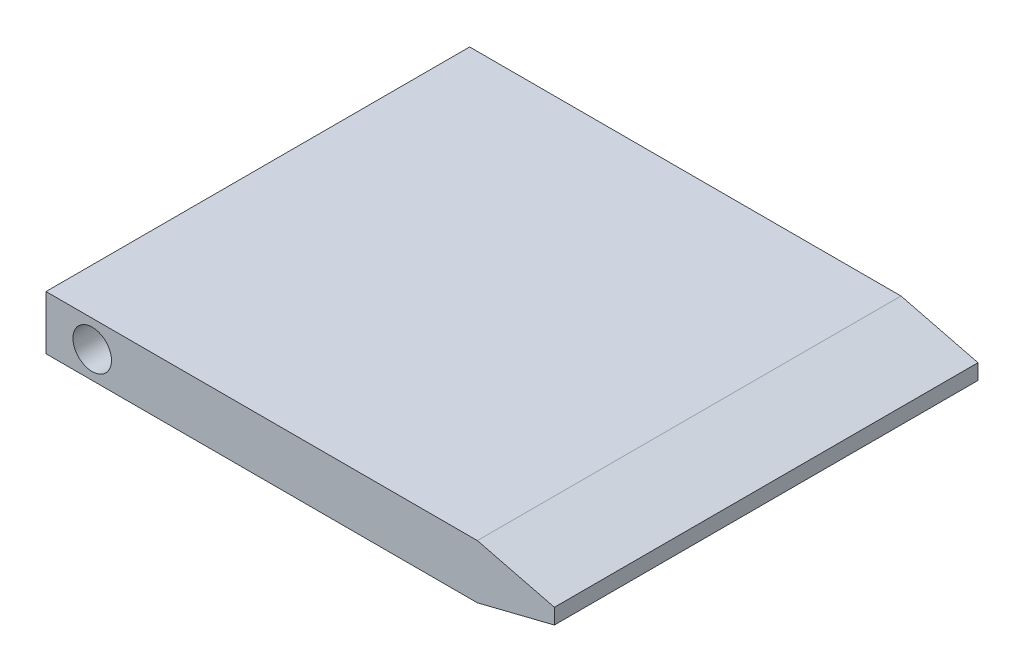
ISO-10303-21;
HEADER;
FILE_DESCRIPTION(('STEP AP214'),'2;1');
FILE_NAME('part.step','',(''),(''),'','','');
FILE_SCHEMA(('AUTOMOTIVE_DESIGN { 1 0 10303 214 1 1 1 1 }'));
ENDSEC;
DATA;
#1=APPLICATION_CONTEXT('core data for automotive mechanical design processes');
#2=APPLICATION_PROTOCOL_DEFINITION('international standard','automotive_design',2000,#1);
#3=PRODUCT_CONTEXT('',#1,'mechanical');
#4=PRODUCT('Part','Part','',(#3));
#5=PRODUCT_RELATED_PRODUCT_CATEGORY('part','',(#4));
#6=PRODUCT_DEFINITION_FORMATION('','',#4);
#7=PRODUCT_DEFINITION_CONTEXT('part definition',#1,'design');
#8=PRODUCT_DEFINITION('design','',#6,#7);
#9=PRODUCT_DEFINITION_SHAPE('','',#8);
#10=(LENGTH_UNIT() NAMED_UNIT(*) SI_UNIT(.MILLI.,.METRE.));
#11=(NAMED_UNIT(*) PLANE_ANGLE_UNIT() SI_UNIT($,.RADIAN.));
#12=(NAMED_UNIT(*) SI_UNIT($,.STERADIAN.) SOLID_ANGLE_UNIT());
#13=UNCERTAINTY_MEASURE_WITH_UNIT(LENGTH_MEASURE(1.E-05),#10,'distance_accuracy_value','');
#14=(GEOMETRIC_REPRESENTATION_CONTEXT(3) GLOBAL_UNCERTAINTY_ASSIGNED_CONTEXT((#13)) GLOBAL_UNIT_ASSIGNED_CONTEXT((#10,
#11,#12)) REPRESENTATION_CONTEXT('',''));
#15=CARTESIAN_POINT('',(0.,0.,0.));
#16=DIRECTION('',(0.,0.,1.));
#17=DIRECTION('',(1.,0.,0.));
#18=AXIS2_PLACEMENT_3D('',#15,#16,#17);
#19=CARTESIAN_POINT('',(-23.59375,7.,8.75));
#20=DIRECTION('',(1.,0.,0.));
#21=DIRECTION('',(0.,0.,-1.));
#22=AXIS2_PLACEMENT_3D('',#19,#20,#21);
#23=PLANE('',#22);
#24=DIRECTION('',(0.,0.,1.));
#25=VECTOR('',#24,1.);
#26=CARTESIAN_POINT('',(-23.59375,0.,8.75));
#27=LINE('',#26,#25);
#28=CARTESIAN_POINT('',(-23.59375,0.,-46.25));
#29=VERTEX_POINT('',#28);
#30=CARTESIAN_POINT('',(-23.59375,0.,8.75));
#31=VERTEX_POINT('',#30);
#32=EDGE_CURVE('E121',#29,#31,#27,.T.);
#33=ORIENTED_EDGE('',*,*,#32,.T.);
#34=DIRECTION('',(0.,-1.,0.));
#35=VECTOR('',#34,1.);
#36=CARTESIAN_POINT('',(-23.59375,7.,8.75));
#37=LINE('',#36,#35);
#38=CARTESIAN_POINT('',(-23.59375,7.,8.75));
#39=VERTEX_POINT('',#38);
#40=EDGE_CURVE('E105',#39,#31,#37,.T.);
#41=ORIENTED_EDGE('',*,*,#40,.F.);
#42=DIRECTION('',(0.,0.,1.));
#43=VECTOR('',#42,1.);
#44=CARTESIAN_POINT('',(-23.59375,7.,8.75));
#45=LINE('',#44,#43);
#46=CARTESIAN_POINT('',(-23.59375,7.,-46.25));
#47=VERTEX_POINT('',#46);
#48=EDGE_CURVE('E110',#47,#39,#45,.T.);
#49=ORIENTED_EDGE('',*,*,#48,.F.);
#50=DIRECTION('',(0.,-1.,0.));
#51=VECTOR('',#50,1.);
#52=CARTESIAN_POINT('',(-23.59375,7.,-46.25));
#53=LINE('',#52,#51);
#54=EDGE_CURVE('E124',#47,#29,#53,.T.);
#55=ORIENTED_EDGE('',*,*,#54,.T.);
#56=EDGE_LOOP('',(#33,#41,#49,#55));
#57=FACE_BOUND('',#56,.T.);
#58=ADVANCED_FACE('F45',(#57),#23,.F.);
#59=CARTESIAN_POINT('',(-23.59375,7.,8.75));
#60=DIRECTION('',(0.,0.,-1.));
#61=DIRECTION('',(-1.,0.,0.));
#62=AXIS2_PLACEMENT_3D('',#59,#60,#61);
#63=PLANE('',#62);
#64=CARTESIAN_POINT('',(-17.59375,3.5,8.75));
#65=DIRECTION('',(0.,0.,1.));
#66=DIRECTION('',(1.,0.,0.));
#67=AXIS2_PLACEMENT_3D('',#64,#65,#66);
#68=CIRCLE('',#67,2.5);
#69=CARTESIAN_POINT('',(-15.09375,3.5,8.75));
#70=VERTEX_POINT('',#69);
#71=EDGE_CURVE('E137',#70,#70,#68,.T.);
#72=ORIENTED_EDGE('',*,*,#71,.F.);
#73=EDGE_LOOP('',(#72));
#74=FACE_BOUND('',#73,.T.);
#75=DIRECTION('',(0.,-1.,0.));
#76=VECTOR('',#75,1.);
#77=CARTESIAN_POINT('',(42.40625,7.,8.75));
#78=LINE('',#77,#76);
#79=CARTESIAN_POINT('',(42.40625,4.5,8.75));
#80=VERTEX_POINT('',#79);
#81=CARTESIAN_POINT('',(42.40625,2.5,8.75));
#82=VERTEX_POINT('',#81);
#83=EDGE_CURVE('E162',#80,#82,#78,.T.);
#84=ORIENTED_EDGE('',*,*,#83,.F.);
#85=DIRECTION('',(-0.970142500145333,0.24253562503633,0.));
#86=VECTOR('',#85,1.);
#87=CARTESIAN_POINT('',(42.40625,4.5,8.75));
#88=LINE('',#87,#86);
#89=CARTESIAN_POINT('',(32.4062499999999,7.,8.75));
#90=VERTEX_POINT('',#89);
#91=EDGE_CURVE('E107',#80,#90,#88,.T.);
#92=ORIENTED_EDGE('',*,*,#91,.T.);
#93=DIRECTION('',(1.,0.,0.));
#94=VECTOR('',#93,1.);
#95=CARTESIAN_POINT('',(-23.59375,7.,8.75));
#96=LINE('',#95,#94);
#97=EDGE_CURVE('E99',#39,#90,#96,.T.);
#98=ORIENTED_EDGE('',*,*,#97,.F.);
#99=ORIENTED_EDGE('',*,*,#40,.T.);
#100=DIRECTION('',(1.,0.,0.));
#101=VECTOR('',#100,1.);
#102=CARTESIAN_POINT('',(-23.59375,0.,8.75));
#103=LINE('',#102,#101);
#104=CARTESIAN_POINT('',(32.4062499999999,0.,8.75));
#105=VERTEX_POINT('',#104);
#106=EDGE_CURVE('E207',#31,#105,#103,.T.);
#107=ORIENTED_EDGE('',*,*,#106,.T.);
#108=DIRECTION('',(-0.970142500145333,-0.24253562503633,0.));
#109=VECTOR('',#108,1.);
#110=CARTESIAN_POINT('',(42.40625,2.5,8.75));
#111=LINE('',#110,#109);
#112=EDGE_CURVE('E142',#105,#82,#111,.F.);
#113=ORIENTED_EDGE('',*,*,#112,.T.);
#114=EDGE_LOOP('',(#84,#92,#98,#99,#107,#113));
#115=FACE_BOUND('',#114,.T.);
#116=ADVANCED_FACE('F102',(#74,#115),#63,.F.);
#117=CARTESIAN_POINT('',(-23.59375,7.,-46.25));
#118=DIRECTION('',(0.,0.,1.));
#119=DIRECTION('',(1.,0.,0.));
#120=AXIS2_PLACEMENT_3D('',#117,#118,#119);
#121=PLANE('',#120);
#122=CARTESIAN_POINT('',(-17.59375,3.5,-46.25));
#123=DIRECTION('',(0.,0.,1.));
#124=DIRECTION('',(1.,0.,0.));
#125=AXIS2_PLACEMENT_3D('',#122,#123,#124);
#126=CIRCLE('',#125,2.5);
#127=CARTESIAN_POINT('',(-15.09375,3.5,-46.25));
#128=VERTEX_POINT('',#127);
#129=EDGE_CURVE('E134',#128,#128,#126,.T.);
#130=ORIENTED_EDGE('',*,*,#129,.T.);
#131=EDGE_LOOP('',(#130));
#132=FACE_BOUND('',#131,.T.);
#133=DIRECTION('',(-1.,0.,0.));
#134=VECTOR('',#133,1.);
#135=CARTESIAN_POINT('',(-23.59375,7.,-46.25));
#136=LINE('',#135,#134);
#137=CARTESIAN_POINT('',(32.4062499999999,7.,-46.25));
#138=VERTEX_POINT('',#137);
#139=EDGE_CURVE('E109',#138,#47,#136,.T.);
#140=ORIENTED_EDGE('',*,*,#139,.F.);
#141=DIRECTION('',(0.970142500145333,-0.24253562503633,0.));
#142=VECTOR('',#141,1.);
#143=CARTESIAN_POINT('',(42.40625,4.5,-46.25));
#144=LINE('',#143,#142);
#145=CARTESIAN_POINT('',(42.40625,4.5,-46.25));
#146=VERTEX_POINT('',#145);
#147=EDGE_CURVE('E55',#138,#146,#144,.T.);
#148=ORIENTED_EDGE('',*,*,#147,.T.);
#149=DIRECTION('',(0.,1.,0.));
#150=VECTOR('',#149,1.);
#151=CARTESIAN_POINT('',(42.40625,7.,-46.25));
#152=LINE('',#151,#150);
#153=CARTESIAN_POINT('',(42.40625,2.5,-46.25));
#154=VERTEX_POINT('',#153);
#155=EDGE_CURVE('E154',#154,#146,#152,.T.);
#156=ORIENTED_EDGE('',*,*,#155,.F.);
#157=DIRECTION('',(0.970142500145333,0.24253562503633,0.));
#158=VECTOR('',#157,1.);
#159=CARTESIAN_POINT('',(42.40625,2.5,-46.25));
#160=LINE('',#159,#158);
#161=CARTESIAN_POINT('',(32.4062499999999,0.,-46.25));
#162=VERTEX_POINT('',#161);
#163=EDGE_CURVE('E62',#154,#162,#160,.F.);
#164=ORIENTED_EDGE('',*,*,#163,.T.);
#165=DIRECTION('',(-1.,0.,0.));
#166=VECTOR('',#165,1.);
#167=CARTESIAN_POINT('',(-23.59375,0.,-46.25));
#168=LINE('',#167,#166);
#169=EDGE_CURVE('E118',#162,#29,#168,.T.);
#170=ORIENTED_EDGE('',*,*,#169,.T.);
#171=ORIENTED_EDGE('',*,*,#54,.F.);
#172=EDGE_LOOP('',(#140,#148,#156,#164,#170,#171));
#173=FACE_BOUND('',#172,.T.);
#174=ADVANCED_FACE('F153',(#132,#173),#121,.F.);
#175=CARTESIAN_POINT('',(0.,7.,0.));
#176=DIRECTION('',(0.,-1.,0.));
#177=DIRECTION('',(0.,0.,-1.));
#178=AXIS2_PLACEMENT_3D('',#175,#176,#177);
#179=PLANE('',#178);
#180=ORIENTED_EDGE('',*,*,#97,.T.);
#181=DIRECTION('',(0.,0.,-1.));
#182=VECTOR('',#181,1.);
#183=CARTESIAN_POINT('',(32.4062499999999,7.,-46.25));
#184=LINE('',#183,#182);
#185=EDGE_CURVE('E70',#90,#138,#184,.T.);
#186=ORIENTED_EDGE('',*,*,#185,.T.);
#187=ORIENTED_EDGE('',*,*,#139,.T.);
#188=ORIENTED_EDGE('',*,*,#48,.T.);
#189=EDGE_LOOP('',(#180,#186,#187,#188));
#190=FACE_BOUND('',#189,.T.);
#191=ADVANCED_FACE('F113',(#190),#179,.F.);
#192=CARTESIAN_POINT('',(0.,0.,0.));
#193=DIRECTION('',(0.,-1.,0.));
#194=DIRECTION('',(0.,0.,-1.));
#195=AXIS2_PLACEMENT_3D('',#192,#193,#194);
#196=PLANE('',#195);
#197=ORIENTED_EDGE('',*,*,#169,.F.);
#198=DIRECTION('',(0.,0.,1.));
#199=VECTOR('',#198,1.);
#200=CARTESIAN_POINT('',(32.4062499999999,0.,0.));
#201=LINE('',#200,#199);
#202=EDGE_CURVE('E11',#162,#105,#201,.T.);
#203=ORIENTED_EDGE('',*,*,#202,.T.);
#204=ORIENTED_EDGE('',*,*,#106,.F.);
#205=ORIENTED_EDGE('',*,*,#32,.F.);
#206=EDGE_LOOP('',(#197,#203,#204,#205));
#207=FACE_BOUND('',#206,.T.);
#208=ADVANCED_FACE('F186',(#207),#196,.T.);
#209=CARTESIAN_POINT('',(-17.59375,3.5,-91.25));
#210=DIRECTION('',(0.,0.,1.));
#211=DIRECTION('',(1.,0.,0.));
#212=AXIS2_PLACEMENT_3D('',#209,#210,#211);
#213=CYLINDRICAL_SURFACE('',#212,2.5);
#214=ORIENTED_EDGE('',*,*,#71,.T.);
#215=EDGE_LOOP('',(#214));
#216=FACE_BOUND('',#215,.T.);
#217=ORIENTED_EDGE('',*,*,#129,.F.);
#218=EDGE_LOOP('',(#217));
#219=FACE_BOUND('',#218,.T.);
#220=ADVANCED_FACE('F171',(#216,#219),#213,.F.);
#221=CARTESIAN_POINT('',(42.40625,0.,0.));
#222=DIRECTION('',(1.,0.,0.));
#223=DIRECTION('',(0.,0.,-1.));
#224=AXIS2_PLACEMENT_3D('',#221,#222,#223);
#225=PLANE('',#224);
#226=ORIENTED_EDGE('',*,*,#155,.T.);
#227=DIRECTION('',(0.,0.,1.));
#228=VECTOR('',#227,1.);
#229=CARTESIAN_POINT('',(42.40625,4.5,8.75));
#230=LINE('',#229,#228);
#231=EDGE_CURVE('E129',#146,#80,#230,.T.);
#232=ORIENTED_EDGE('',*,*,#231,.T.);
#233=ORIENTED_EDGE('',*,*,#83,.T.);
#234=DIRECTION('',(0.,0.,-1.));
#235=VECTOR('',#234,1.);
#236=CARTESIAN_POINT('',(42.40625,2.5,0.));
#237=LINE('',#236,#235);
#238=EDGE_CURVE('E123',#82,#154,#237,.T.);
#239=ORIENTED_EDGE('',*,*,#238,.T.);
#240=EDGE_LOOP('',(#226,#232,#233,#239));
#241=FACE_BOUND('',#240,.T.);
#242=ADVANCED_FACE('F158',(#241),#225,.T.);
#243=CARTESIAN_POINT('',(42.40625,4.5,0.));
#244=DIRECTION('',(0.24253562503633,0.970142500145333,0.));
#245=DIRECTION('',(0.,0.,-1.));
#246=AXIS2_PLACEMENT_3D('',#243,#244,#245);
#247=PLANE('',#246);
#248=ORIENTED_EDGE('',*,*,#147,.F.);
#249=ORIENTED_EDGE('',*,*,#185,.F.);
#250=ORIENTED_EDGE('',*,*,#91,.F.);
#251=ORIENTED_EDGE('',*,*,#231,.F.);
#252=EDGE_LOOP('',(#248,#249,#250,#251));
#253=FACE_BOUND('',#252,.T.);
#254=ADVANCED_FACE('F164',(#253),#247,.T.);
#255=CARTESIAN_POINT('',(42.40625,2.5,0.));
#256=DIRECTION('',(-0.24253562503633,0.970142500145333,0.));
#257=DIRECTION('',(0.,0.,-1.));
#258=AXIS2_PLACEMENT_3D('',#255,#256,#257);
#259=PLANE('',#258);
#260=ORIENTED_EDGE('',*,*,#112,.F.);
#261=ORIENTED_EDGE('',*,*,#202,.F.);
#262=ORIENTED_EDGE('',*,*,#163,.F.);
#263=ORIENTED_EDGE('',*,*,#238,.F.);
#264=EDGE_LOOP('',(#260,#261,#262,#263));
#265=FACE_BOUND('',#264,.T.);
#266=ADVANCED_FACE('F48',(#265),#259,.F.);
#267=CLOSED_SHELL('',(#58,#116,#174,#191,#208,#220,#242,#254,#266));
#268=MANIFOLD_SOLID_BREP('B2',#267);
#269=ADVANCED_BREP_SHAPE_REPRESENTATION('',(#18,#268),#14);
#270=SHAPE_DEFINITION_REPRESENTATION(#9,#269);
ENDSEC;
END-ISO-10303-21;
